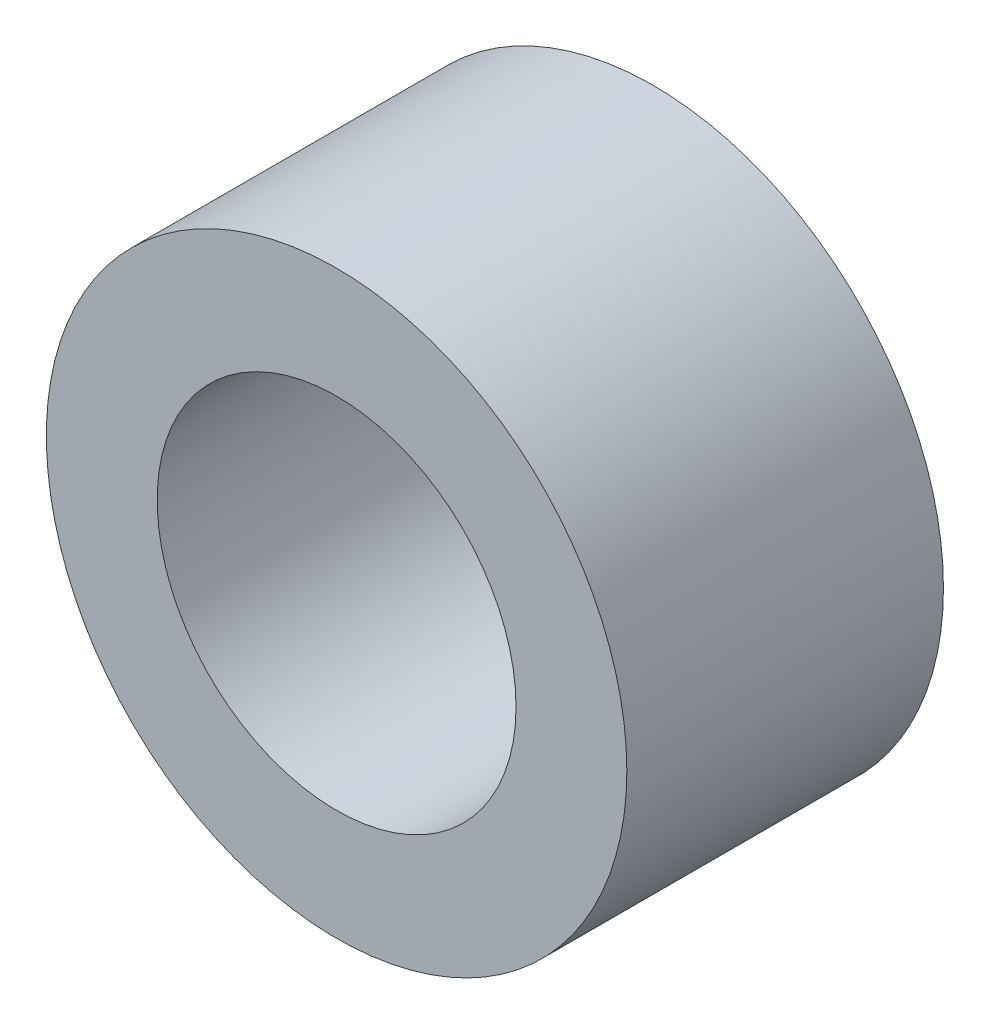
ISO-10303-21;
HEADER;
FILE_DESCRIPTION(('STEP AP214'),'2;1');
FILE_NAME('part.step','',(''),(''),'','','');
FILE_SCHEMA(('AUTOMOTIVE_DESIGN { 1 0 10303 214 1 1 1 1 }'));
ENDSEC;
DATA;
#1=APPLICATION_CONTEXT('core data for automotive mechanical design processes');
#2=APPLICATION_PROTOCOL_DEFINITION('international standard','automotive_design',2000,#1);
#3=PRODUCT_CONTEXT('',#1,'mechanical');
#4=PRODUCT('Part','Part','',(#3));
#5=PRODUCT_RELATED_PRODUCT_CATEGORY('part','',(#4));
#6=PRODUCT_DEFINITION_FORMATION('','',#4);
#7=PRODUCT_DEFINITION_CONTEXT('part definition',#1,'design');
#8=PRODUCT_DEFINITION('design','',#6,#7);
#9=PRODUCT_DEFINITION_SHAPE('','',#8);
#10=(LENGTH_UNIT() NAMED_UNIT(*) SI_UNIT(.MILLI.,.METRE.));
#11=(NAMED_UNIT(*) PLANE_ANGLE_UNIT() SI_UNIT($,.RADIAN.));
#12=(NAMED_UNIT(*) SI_UNIT($,.STERADIAN.) SOLID_ANGLE_UNIT());
#13=UNCERTAINTY_MEASURE_WITH_UNIT(LENGTH_MEASURE(1.E-05),#10,'distance_accuracy_value','');
#14=(GEOMETRIC_REPRESENTATION_CONTEXT(3) GLOBAL_UNCERTAINTY_ASSIGNED_CONTEXT((#13)) GLOBAL_UNIT_ASSIGNED_CONTEXT((#10,
#11,#12)) REPRESENTATION_CONTEXT('',''));
#15=CARTESIAN_POINT('',(0.,0.,0.));
#16=DIRECTION('',(0.,0.,1.));
#17=DIRECTION('',(1.,0.,0.));
#18=AXIS2_PLACEMENT_3D('',#15,#16,#17);
#19=CARTESIAN_POINT('',(0.,0.,3.));
#20=DIRECTION('',(0.,0.,1.));
#21=DIRECTION('',(1.,0.,0.));
#22=AXIS2_PLACEMENT_3D('',#19,#20,#21);
#23=PLANE('',#22);
#24=CARTESIAN_POINT('',(0.,0.,3.));
#25=DIRECTION('',(0.,0.,1.));
#26=DIRECTION('',(1.,0.,0.));
#27=AXIS2_PLACEMENT_3D('',#24,#25,#26);
#28=CIRCLE('',#27,2.75);
#29=CARTESIAN_POINT('',(2.75,0.,3.));
#30=VERTEX_POINT('',#29);
#31=EDGE_CURVE('E10',#30,#30,#28,.T.);
#32=ORIENTED_EDGE('',*,*,#31,.T.);
#33=EDGE_LOOP('',(#32));
#34=FACE_BOUND('',#33,.T.);
#35=CARTESIAN_POINT('',(0.,0.,3.));
#36=DIRECTION('',(0.,0.,1.));
#37=DIRECTION('',(1.,0.,0.));
#38=AXIS2_PLACEMENT_3D('',#35,#36,#37);
#39=CIRCLE('',#38,1.7);
#40=CARTESIAN_POINT('',(1.7,0.,3.));
#41=VERTEX_POINT('',#40);
#42=EDGE_CURVE('E56',#41,#41,#39,.T.);
#43=ORIENTED_EDGE('',*,*,#42,.F.);
#44=EDGE_LOOP('',(#43));
#45=FACE_BOUND('',#44,.T.);
#46=ADVANCED_FACE('F43',(#34,#45),#23,.T.);
#47=CARTESIAN_POINT('',(0.,0.,0.));
#48=DIRECTION('',(0.,0.,1.));
#49=DIRECTION('',(1.,0.,0.));
#50=AXIS2_PLACEMENT_3D('',#47,#48,#49);
#51=PLANE('',#50);
#52=CARTESIAN_POINT('',(0.,0.,0.));
#53=DIRECTION('',(0.,0.,1.));
#54=DIRECTION('',(1.,0.,0.));
#55=AXIS2_PLACEMENT_3D('',#52,#53,#54);
#56=CIRCLE('',#55,2.75);
#57=CARTESIAN_POINT('',(2.75,0.,0.));
#58=VERTEX_POINT('',#57);
#59=EDGE_CURVE('E47',#58,#58,#56,.T.);
#60=ORIENTED_EDGE('',*,*,#59,.F.);
#61=EDGE_LOOP('',(#60));
#62=FACE_BOUND('',#61,.T.);
#63=CARTESIAN_POINT('',(0.,0.,0.));
#64=DIRECTION('',(0.,0.,1.));
#65=DIRECTION('',(1.,0.,0.));
#66=AXIS2_PLACEMENT_3D('',#63,#64,#65);
#67=CIRCLE('',#66,1.7);
#68=CARTESIAN_POINT('',(1.7,0.,0.));
#69=VERTEX_POINT('',#68);
#70=EDGE_CURVE('E58',#69,#69,#67,.T.);
#71=ORIENTED_EDGE('',*,*,#70,.T.);
#72=EDGE_LOOP('',(#71));
#73=FACE_BOUND('',#72,.T.);
#74=ADVANCED_FACE('F70',(#62,#73),#51,.F.);
#75=CARTESIAN_POINT('',(0.,0.,3.));
#76=DIRECTION('',(0.,0.,-1.));
#77=DIRECTION('',(-1.,0.,0.));
#78=AXIS2_PLACEMENT_3D('',#75,#76,#77);
#79=CYLINDRICAL_SURFACE('',#78,2.75);
#80=ORIENTED_EDGE('',*,*,#31,.F.);
#81=EDGE_LOOP('',(#80));
#82=FACE_BOUND('',#81,.T.);
#83=ORIENTED_EDGE('',*,*,#59,.T.);
#84=EDGE_LOOP('',(#83));
#85=FACE_BOUND('',#84,.T.);
#86=ADVANCED_FACE('F45',(#82,#85),#79,.T.);
#87=CARTESIAN_POINT('',(0.,0.,3.));
#88=DIRECTION('',(0.,0.,-1.));
#89=DIRECTION('',(-1.,0.,0.));
#90=AXIS2_PLACEMENT_3D('',#87,#88,#89);
#91=CYLINDRICAL_SURFACE('',#90,1.7);
#92=ORIENTED_EDGE('',*,*,#42,.T.);
#93=EDGE_LOOP('',(#92));
#94=FACE_BOUND('',#93,.T.);
#95=ORIENTED_EDGE('',*,*,#70,.F.);
#96=EDGE_LOOP('',(#95));
#97=FACE_BOUND('',#96,.T.);
#98=ADVANCED_FACE('F66',(#94,#97),#91,.F.);
#99=CLOSED_SHELL('',(#46,#74,#86,#98));
#100=MANIFOLD_SOLID_BREP('B2',#99);
#101=ADVANCED_BREP_SHAPE_REPRESENTATION('',(#18,#100),#14);
#102=SHAPE_DEFINITION_REPRESENTATION(#9,#101);
ENDSEC;
END-ISO-10303-21;
